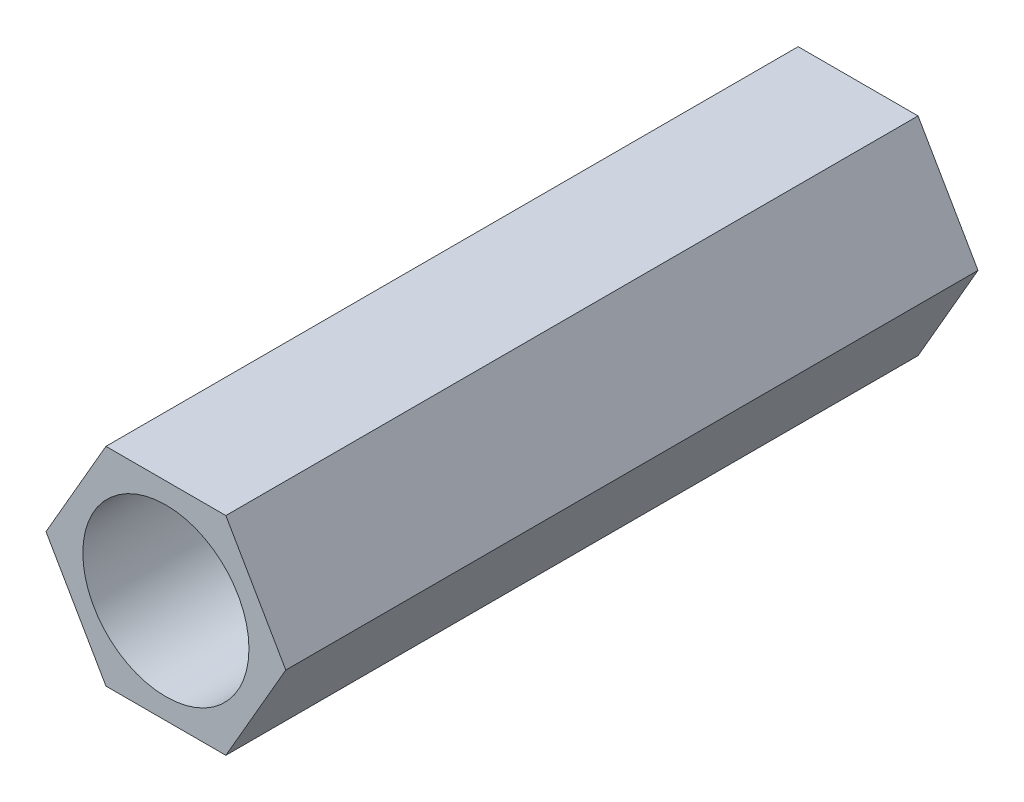
ISO-10303-21;
HEADER;
FILE_DESCRIPTION(('STEP AP214'),'2;1');
FILE_NAME('part.step','',(''),(''),'','','');
FILE_SCHEMA(('AUTOMOTIVE_DESIGN { 1 0 10303 214 1 1 1 1 }'));
ENDSEC;
DATA;
#1=APPLICATION_CONTEXT('core data for automotive mechanical design processes');
#2=APPLICATION_PROTOCOL_DEFINITION('international standard','automotive_design',2000,#1);
#3=PRODUCT_CONTEXT('',#1,'mechanical');
#4=PRODUCT('Part','Part','',(#3));
#5=PRODUCT_RELATED_PRODUCT_CATEGORY('part','',(#4));
#6=PRODUCT_DEFINITION_FORMATION('','',#4);
#7=PRODUCT_DEFINITION_CONTEXT('part definition',#1,'design');
#8=PRODUCT_DEFINITION('design','',#6,#7);
#9=PRODUCT_DEFINITION_SHAPE('','',#8);
#10=(LENGTH_UNIT() NAMED_UNIT(*) SI_UNIT(.MILLI.,.METRE.));
#11=(NAMED_UNIT(*) PLANE_ANGLE_UNIT() SI_UNIT($,.RADIAN.));
#12=(NAMED_UNIT(*) SI_UNIT($,.STERADIAN.) SOLID_ANGLE_UNIT());
#13=UNCERTAINTY_MEASURE_WITH_UNIT(LENGTH_MEASURE(1.E-05),#10,'distance_accuracy_value','');
#14=(GEOMETRIC_REPRESENTATION_CONTEXT(3) GLOBAL_UNCERTAINTY_ASSIGNED_CONTEXT((#13)) GLOBAL_UNIT_ASSIGNED_CONTEXT((#10,
#11,#12)) REPRESENTATION_CONTEXT('',''));
#15=CARTESIAN_POINT('',(0.,0.,0.));
#16=DIRECTION('',(0.,0.,1.));
#17=DIRECTION('',(1.,0.,0.));
#18=AXIS2_PLACEMENT_3D('',#15,#16,#17);
#19=CARTESIAN_POINT('',(0.,0.,0.));
#20=DIRECTION('',(0.,0.,1.));
#21=DIRECTION('',(1.,0.,0.));
#22=AXIS2_PLACEMENT_3D('',#19,#20,#21);
#23=PLANE('',#22);
#24=DIRECTION('',(1.,0.,0.));
#25=VECTOR('',#24,1.);
#26=CARTESIAN_POINT('',(-0.866025403784438,-1.5,0.));
#27=LINE('',#26,#25);
#28=CARTESIAN_POINT('',(-0.866025403784438,-1.5,0.));
#29=VERTEX_POINT('',#28);
#30=CARTESIAN_POINT('',(0.866025403784439,-1.5,0.));
#31=VERTEX_POINT('',#30);
#32=EDGE_CURVE('E117',#29,#31,#27,.T.);
#33=ORIENTED_EDGE('',*,*,#32,.F.);
#34=DIRECTION('',(0.5,-0.866025403784439,0.));
#35=VECTOR('',#34,1.);
#36=CARTESIAN_POINT('',(-1.73205080756888,0.,0.));
#37=LINE('',#36,#35);
#38=CARTESIAN_POINT('',(-1.73205080756888,0.,0.));
#39=VERTEX_POINT('',#38);
#40=EDGE_CURVE('E78',#39,#29,#37,.T.);
#41=ORIENTED_EDGE('',*,*,#40,.F.);
#42=DIRECTION('',(-0.5,-0.866025403784439,0.));
#43=VECTOR('',#42,1.);
#44=CARTESIAN_POINT('',(-0.866025403784439,1.5,0.));
#45=LINE('',#44,#43);
#46=CARTESIAN_POINT('',(-0.866025403784439,1.5,0.));
#47=VERTEX_POINT('',#46);
#48=EDGE_CURVE('E72',#47,#39,#45,.T.);
#49=ORIENTED_EDGE('',*,*,#48,.F.);
#50=DIRECTION('',(-1.,0.,0.));
#51=VECTOR('',#50,1.);
#52=CARTESIAN_POINT('',(0.866025403784439,1.5,0.));
#53=LINE('',#52,#51);
#54=CARTESIAN_POINT('',(0.866025403784439,1.5,0.));
#55=VERTEX_POINT('',#54);
#56=EDGE_CURVE('E107',#55,#47,#53,.T.);
#57=ORIENTED_EDGE('',*,*,#56,.F.);
#58=DIRECTION('',(-0.5,0.866025403784439,0.));
#59=VECTOR('',#58,1.);
#60=CARTESIAN_POINT('',(1.73205080756888,0.,0.));
#61=LINE('',#60,#59);
#62=CARTESIAN_POINT('',(1.73205080756888,0.,0.));
#63=VERTEX_POINT('',#62);
#64=EDGE_CURVE('E123',#63,#55,#61,.T.);
#65=ORIENTED_EDGE('',*,*,#64,.F.);
#66=DIRECTION('',(0.5,0.866025403784439,0.));
#67=VECTOR('',#66,1.);
#68=CARTESIAN_POINT('',(0.866025403784439,-1.5,0.));
#69=LINE('',#68,#67);
#70=EDGE_CURVE('E120',#31,#63,#69,.T.);
#71=ORIENTED_EDGE('',*,*,#70,.F.);
#72=EDGE_LOOP('',(#33,#41,#49,#57,#65,#71));
#73=FACE_BOUND('',#72,.T.);
#74=CARTESIAN_POINT('',(0.,0.,0.));
#75=DIRECTION('',(0.,0.,-1.));
#76=DIRECTION('',(-1.,0.,0.));
#77=AXIS2_PLACEMENT_3D('',#74,#75,#76);
#78=CIRCLE('',#77,1.19999999999999);
#79=CARTESIAN_POINT('',(-1.19999999999999,0.,0.));
#80=VERTEX_POINT('',#79);
#81=EDGE_CURVE('E168',#80,#80,#78,.T.);
#82=ORIENTED_EDGE('',*,*,#81,.F.);
#83=EDGE_LOOP('',(#82));
#84=FACE_BOUND('',#83,.T.);
#85=ADVANCED_FACE('F32',(#73,#84),#23,.F.);
#86=CARTESIAN_POINT('',(-0.866025403784438,-1.5,10.));
#87=DIRECTION('',(0.,1.,0.));
#88=DIRECTION('',(-1.,0.,0.));
#89=AXIS2_PLACEMENT_3D('',#86,#87,#88);
#90=PLANE('',#89);
#91=ORIENTED_EDGE('',*,*,#32,.T.);
#92=DIRECTION('',(0.,0.,-1.));
#93=VECTOR('',#92,1.);
#94=CARTESIAN_POINT('',(0.866025403784439,-1.5,10.));
#95=LINE('',#94,#93);
#96=CARTESIAN_POINT('',(0.866025403784439,-1.5,10.));
#97=VERTEX_POINT('',#96);
#98=EDGE_CURVE('E11',#97,#31,#95,.T.);
#99=ORIENTED_EDGE('',*,*,#98,.F.);
#100=DIRECTION('',(1.,0.,0.));
#101=VECTOR('',#100,1.);
#102=CARTESIAN_POINT('',(-0.866025403784438,-1.5,10.));
#103=LINE('',#102,#101);
#104=CARTESIAN_POINT('',(-0.866025403784438,-1.5,10.));
#105=VERTEX_POINT('',#104);
#106=EDGE_CURVE('E128',#105,#97,#103,.T.);
#107=ORIENTED_EDGE('',*,*,#106,.F.);
#108=DIRECTION('',(0.,0.,-1.));
#109=VECTOR('',#108,1.);
#110=CARTESIAN_POINT('',(-0.866025403784438,-1.5,10.));
#111=LINE('',#110,#109);
#112=EDGE_CURVE('E113',#105,#29,#111,.T.);
#113=ORIENTED_EDGE('',*,*,#112,.T.);
#114=EDGE_LOOP('',(#91,#99,#107,#113));
#115=FACE_BOUND('',#114,.T.);
#116=ADVANCED_FACE('F34',(#115),#90,.F.);
#117=CARTESIAN_POINT('',(0.866025403784439,-1.5,10.));
#118=DIRECTION('',(-0.866025403784439,0.5,0.));
#119=DIRECTION('',(-0.5,-0.866025403784439,0.));
#120=AXIS2_PLACEMENT_3D('',#117,#118,#119);
#121=PLANE('',#120);
#122=ORIENTED_EDGE('',*,*,#70,.T.);
#123=DIRECTION('',(0.,0.,-1.));
#124=VECTOR('',#123,1.);
#125=CARTESIAN_POINT('',(1.73205080756888,0.,10.));
#126=LINE('',#125,#124);
#127=CARTESIAN_POINT('',(1.73205080756888,0.,10.));
#128=VERTEX_POINT('',#127);
#129=EDGE_CURVE('E41',#128,#63,#126,.T.);
#130=ORIENTED_EDGE('',*,*,#129,.F.);
#131=DIRECTION('',(0.5,0.866025403784439,0.));
#132=VECTOR('',#131,1.);
#133=CARTESIAN_POINT('',(0.866025403784439,-1.5,10.));
#134=LINE('',#133,#132);
#135=EDGE_CURVE('E86',#97,#128,#134,.T.);
#136=ORIENTED_EDGE('',*,*,#135,.F.);
#137=ORIENTED_EDGE('',*,*,#98,.T.);
#138=EDGE_LOOP('',(#122,#130,#136,#137));
#139=FACE_BOUND('',#138,.T.);
#140=ADVANCED_FACE('F157',(#139),#121,.F.);
#141=CARTESIAN_POINT('',(1.73205080756888,0.,10.));
#142=DIRECTION('',(-0.866025403784439,-0.5,0.));
#143=DIRECTION('',(0.5,-0.866025403784439,0.));
#144=AXIS2_PLACEMENT_3D('',#141,#142,#143);
#145=PLANE('',#144);
#146=ORIENTED_EDGE('',*,*,#64,.T.);
#147=DIRECTION('',(0.,0.,-1.));
#148=VECTOR('',#147,1.);
#149=CARTESIAN_POINT('',(0.866025403784439,1.5,10.));
#150=LINE('',#149,#148);
#151=CARTESIAN_POINT('',(0.866025403784439,1.5,10.));
#152=VERTEX_POINT('',#151);
#153=EDGE_CURVE('E108',#152,#55,#150,.T.);
#154=ORIENTED_EDGE('',*,*,#153,.F.);
#155=DIRECTION('',(-0.5,0.866025403784439,0.));
#156=VECTOR('',#155,1.);
#157=CARTESIAN_POINT('',(1.73205080756888,0.,10.));
#158=LINE('',#157,#156);
#159=EDGE_CURVE('E99',#128,#152,#158,.T.);
#160=ORIENTED_EDGE('',*,*,#159,.F.);
#161=ORIENTED_EDGE('',*,*,#129,.T.);
#162=EDGE_LOOP('',(#146,#154,#160,#161));
#163=FACE_BOUND('',#162,.T.);
#164=ADVANCED_FACE('F134',(#163),#145,.F.);
#165=CARTESIAN_POINT('',(0.866025403784439,1.5,10.));
#166=DIRECTION('',(0.,-1.,0.));
#167=DIRECTION('',(0.,0.,-1.));
#168=AXIS2_PLACEMENT_3D('',#165,#166,#167);
#169=PLANE('',#168);
#170=ORIENTED_EDGE('',*,*,#56,.T.);
#171=DIRECTION('',(0.,0.,-1.));
#172=VECTOR('',#171,1.);
#173=CARTESIAN_POINT('',(-0.866025403784439,1.5,10.));
#174=LINE('',#173,#172);
#175=CARTESIAN_POINT('',(-0.866025403784439,1.5,10.));
#176=VERTEX_POINT('',#175);
#177=EDGE_CURVE('E104',#176,#47,#174,.T.);
#178=ORIENTED_EDGE('',*,*,#177,.F.);
#179=DIRECTION('',(-1.,0.,0.));
#180=VECTOR('',#179,1.);
#181=CARTESIAN_POINT('',(0.866025403784439,1.5,10.));
#182=LINE('',#181,#180);
#183=EDGE_CURVE('E93',#152,#176,#182,.T.);
#184=ORIENTED_EDGE('',*,*,#183,.F.);
#185=ORIENTED_EDGE('',*,*,#153,.T.);
#186=EDGE_LOOP('',(#170,#178,#184,#185));
#187=FACE_BOUND('',#186,.T.);
#188=ADVANCED_FACE('F105',(#187),#169,.F.);
#189=CARTESIAN_POINT('',(-0.866025403784439,1.5,10.));
#190=DIRECTION('',(0.866025403784439,-0.5,0.));
#191=DIRECTION('',(0.5,0.866025403784439,0.));
#192=AXIS2_PLACEMENT_3D('',#189,#190,#191);
#193=PLANE('',#192);
#194=ORIENTED_EDGE('',*,*,#48,.T.);
#195=DIRECTION('',(0.,0.,-1.));
#196=VECTOR('',#195,1.);
#197=CARTESIAN_POINT('',(-1.73205080756888,0.,10.));
#198=LINE('',#197,#196);
#199=CARTESIAN_POINT('',(-1.73205080756888,0.,10.));
#200=VERTEX_POINT('',#199);
#201=EDGE_CURVE('E109',#200,#39,#198,.T.);
#202=ORIENTED_EDGE('',*,*,#201,.F.);
#203=DIRECTION('',(-0.5,-0.866025403784439,0.));
#204=VECTOR('',#203,1.);
#205=CARTESIAN_POINT('',(-0.866025403784439,1.5,10.));
#206=LINE('',#205,#204);
#207=EDGE_CURVE('E97',#176,#200,#206,.T.);
#208=ORIENTED_EDGE('',*,*,#207,.F.);
#209=ORIENTED_EDGE('',*,*,#177,.T.);
#210=EDGE_LOOP('',(#194,#202,#208,#209));
#211=FACE_BOUND('',#210,.T.);
#212=ADVANCED_FACE('F111',(#211),#193,.F.);
#213=CARTESIAN_POINT('',(-1.73205080756888,0.,10.));
#214=DIRECTION('',(0.866025403784439,0.5,0.));
#215=DIRECTION('',(-0.5,0.866025403784439,0.));
#216=AXIS2_PLACEMENT_3D('',#213,#214,#215);
#217=PLANE('',#216);
#218=ORIENTED_EDGE('',*,*,#40,.T.);
#219=ORIENTED_EDGE('',*,*,#112,.F.);
#220=DIRECTION('',(0.5,-0.866025403784439,0.));
#221=VECTOR('',#220,1.);
#222=CARTESIAN_POINT('',(-1.73205080756888,0.,10.));
#223=LINE('',#222,#221);
#224=EDGE_CURVE('E49',#200,#105,#223,.T.);
#225=ORIENTED_EDGE('',*,*,#224,.F.);
#226=ORIENTED_EDGE('',*,*,#201,.T.);
#227=EDGE_LOOP('',(#218,#219,#225,#226));
#228=FACE_BOUND('',#227,.T.);
#229=ADVANCED_FACE('F141',(#228),#217,.F.);
#230=CARTESIAN_POINT('',(0.,0.,10.));
#231=DIRECTION('',(0.,0.,1.));
#232=DIRECTION('',(1.,0.,0.));
#233=AXIS2_PLACEMENT_3D('',#230,#231,#232);
#234=PLANE('',#233);
#235=CARTESIAN_POINT('',(0.,0.,10.));
#236=DIRECTION('',(0.,0.,-1.));
#237=DIRECTION('',(-1.,0.,0.));
#238=AXIS2_PLACEMENT_3D('',#235,#236,#237);
#239=CIRCLE('',#238,1.2);
#240=CARTESIAN_POINT('',(-1.2,0.,10.));
#241=VERTEX_POINT('',#240);
#242=EDGE_CURVE('E121',#241,#241,#239,.T.);
#243=ORIENTED_EDGE('',*,*,#242,.T.);
#244=EDGE_LOOP('',(#243));
#245=FACE_BOUND('',#244,.T.);
#246=ORIENTED_EDGE('',*,*,#106,.T.);
#247=ORIENTED_EDGE('',*,*,#135,.T.);
#248=ORIENTED_EDGE('',*,*,#159,.T.);
#249=ORIENTED_EDGE('',*,*,#183,.T.);
#250=ORIENTED_EDGE('',*,*,#207,.T.);
#251=ORIENTED_EDGE('',*,*,#224,.T.);
#252=EDGE_LOOP('',(#246,#247,#248,#249,#250,#251));
#253=FACE_BOUND('',#252,.T.);
#254=ADVANCED_FACE('F95',(#245,#253),#234,.T.);
#255=CARTESIAN_POINT('',(0.,0.,0.));
#256=DIRECTION('',(0.,0.,-1.));
#257=DIRECTION('',(-1.,0.,0.));
#258=AXIS2_PLACEMENT_3D('',#255,#256,#257);
#259=CYLINDRICAL_SURFACE('',#258,1.19999999999999);
#260=ORIENTED_EDGE('',*,*,#242,.F.);
#261=EDGE_LOOP('',(#260));
#262=FACE_BOUND('',#261,.T.);
#263=ORIENTED_EDGE('',*,*,#81,.T.);
#264=EDGE_LOOP('',(#263));
#265=FACE_BOUND('',#264,.T.);
#266=ADVANCED_FACE('F148',(#262,#265),#259,.F.);
#267=CLOSED_SHELL('',(#85,#116,#140,#164,#188,#212,#229,#254,#266));
#268=MANIFOLD_SOLID_BREP('B2',#267);
#269=ADVANCED_BREP_SHAPE_REPRESENTATION('',(#18,#268),#14);
#270=SHAPE_DEFINITION_REPRESENTATION(#9,#269);
ENDSEC;
END-ISO-10303-21;
